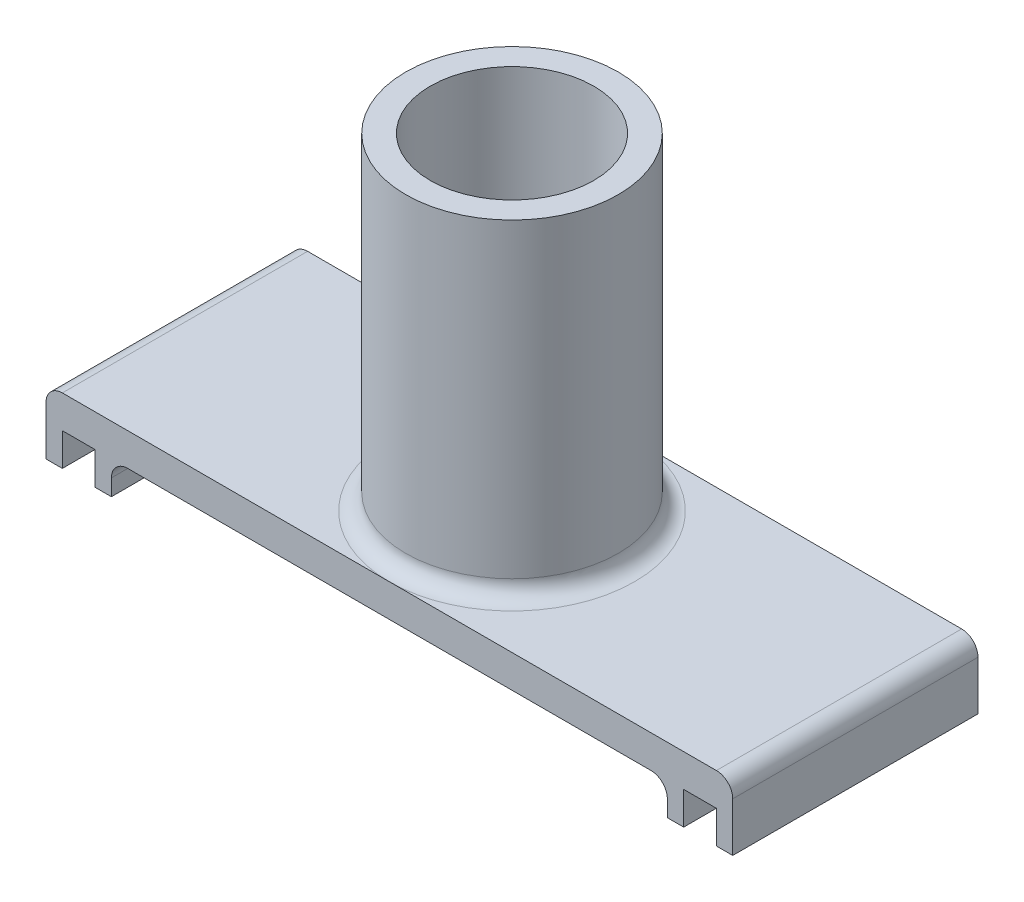
ISO-10303-21;
HEADER;
FILE_DESCRIPTION(('STEP AP214'),'2;1');
FILE_NAME('part.step','',(''),(''),'','','');
FILE_SCHEMA(('AUTOMOTIVE_DESIGN { 1 0 10303 214 1 1 1 1 }'));
ENDSEC;
DATA;
#1=APPLICATION_CONTEXT('core data for automotive mechanical design processes');
#2=APPLICATION_PROTOCOL_DEFINITION('international standard','automotive_design',2000,#1);
#3=PRODUCT_CONTEXT('',#1,'mechanical');
#4=PRODUCT('Part','Part','',(#3));
#5=PRODUCT_RELATED_PRODUCT_CATEGORY('part','',(#4));
#6=PRODUCT_DEFINITION_FORMATION('','',#4);
#7=PRODUCT_DEFINITION_CONTEXT('part definition',#1,'design');
#8=PRODUCT_DEFINITION('design','',#6,#7);
#9=PRODUCT_DEFINITION_SHAPE('','',#8);
#10=(LENGTH_UNIT() NAMED_UNIT(*) SI_UNIT(.MILLI.,.METRE.));
#11=(NAMED_UNIT(*) PLANE_ANGLE_UNIT() SI_UNIT($,.RADIAN.));
#12=(NAMED_UNIT(*) SI_UNIT($,.STERADIAN.) SOLID_ANGLE_UNIT());
#13=UNCERTAINTY_MEASURE_WITH_UNIT(LENGTH_MEASURE(1.E-05),#10,'distance_accuracy_value','');
#14=(GEOMETRIC_REPRESENTATION_CONTEXT(3) GLOBAL_UNCERTAINTY_ASSIGNED_CONTEXT((#13)) GLOBAL_UNIT_ASSIGNED_CONTEXT((#10,
#11,#12)) REPRESENTATION_CONTEXT('',''));
#15=CARTESIAN_POINT('',(0.,0.,0.));
#16=DIRECTION('',(0.,0.,1.));
#17=DIRECTION('',(1.,0.,0.));
#18=AXIS2_PLACEMENT_3D('',#15,#16,#17);
#19=CARTESIAN_POINT('',(0.,20.,0.));
#20=DIRECTION('',(0.,-1.,0.));
#21=DIRECTION('',(0.,0.,-1.));
#22=AXIS2_PLACEMENT_3D('',#19,#20,#21);
#23=PLANE('',#22);
#24=DIRECTION('',(-1.,0.,0.));
#25=VECTOR('',#24,1.);
#26=CARTESIAN_POINT('',(-210.,20.,-75.));
#27=LINE('',#26,#25);
#28=CARTESIAN_POINT('',(200.,20.,-75.));
#29=VERTEX_POINT('',#28);
#30=CARTESIAN_POINT('',(0.,20.,-75.));
#31=VERTEX_POINT('',#30);
#32=EDGE_CURVE('E230',#29,#31,#27,.T.);
#33=ORIENTED_EDGE('',*,*,#32,.T.);
#34=CARTESIAN_POINT('',(0.,20.,0.));
#35=DIRECTION('',(0.,-1.,0.));
#36=DIRECTION('',(0.,0.,-1.));
#37=AXIS2_PLACEMENT_3D('',#34,#35,#36);
#38=CIRCLE('',#37,75.);
#39=CARTESIAN_POINT('',(0.,20.,75.));
#40=VERTEX_POINT('',#39);
#41=EDGE_CURVE('E11',#31,#40,#38,.T.);
#42=ORIENTED_EDGE('',*,*,#41,.T.);
#43=DIRECTION('',(1.,0.,0.));
#44=VECTOR('',#43,1.);
#45=CARTESIAN_POINT('',(-210.,20.,75.));
#46=LINE('',#45,#44);
#47=CARTESIAN_POINT('',(200.,20.,75.));
#48=VERTEX_POINT('',#47);
#49=EDGE_CURVE('E232',#40,#48,#46,.T.);
#50=ORIENTED_EDGE('',*,*,#49,.T.);
#51=DIRECTION('',(0.,0.,-1.));
#52=VECTOR('',#51,1.);
#53=CARTESIAN_POINT('',(200.,20.,0.));
#54=LINE('',#53,#52);
#55=EDGE_CURVE('E245',#48,#29,#54,.T.);
#56=ORIENTED_EDGE('',*,*,#55,.T.);
#57=EDGE_LOOP('',(#33,#42,#50,#56));
#58=FACE_BOUND('',#57,.T.);
#59=ADVANCED_FACE('F41',(#58),#23,.F.);
#60=CARTESIAN_POINT('',(0.,0.,0.));
#61=DIRECTION('',(0.,-1.,0.));
#62=DIRECTION('',(0.,0.,-1.));
#63=AXIS2_PLACEMENT_3D('',#60,#61,#62);
#64=PLANE('',#63);
#65=DIRECTION('',(1.,0.,0.));
#66=VECTOR('',#65,1.);
#67=CARTESIAN_POINT('',(-210.,0.,75.));
#68=LINE('',#67,#66);
#69=CARTESIAN_POINT('',(180.000000000013,0.,75.));
#70=VERTEX_POINT('',#69);
#71=CARTESIAN_POINT('',(200.,0.,75.));
#72=VERTEX_POINT('',#71);
#73=EDGE_CURVE('E200',#70,#72,#68,.T.);
#74=ORIENTED_EDGE('',*,*,#73,.F.);
#75=DIRECTION('',(0.,0.,1.));
#76=VECTOR('',#75,1.);
#77=CARTESIAN_POINT('',(180.,0.,-75.0000000000013));
#78=LINE('',#77,#76);
#79=CARTESIAN_POINT('',(180.,0.,-75.0000000000013));
#80=VERTEX_POINT('',#79);
#81=EDGE_CURVE('E185',#80,#70,#78,.T.);
#82=ORIENTED_EDGE('',*,*,#81,.F.);
#83=DIRECTION('',(-1.,0.,0.));
#84=VECTOR('',#83,1.);
#85=CARTESIAN_POINT('',(-210.,0.,-75.));
#86=LINE('',#85,#84);
#87=CARTESIAN_POINT('',(200.,0.,-75.));
#88=VERTEX_POINT('',#87);
#89=EDGE_CURVE('E199',#88,#80,#86,.T.);
#90=ORIENTED_EDGE('',*,*,#89,.F.);
#91=DIRECTION('',(0.,0.,1.));
#92=VECTOR('',#91,1.);
#93=CARTESIAN_POINT('',(200.,0.,-2.368475785867E-12));
#94=LINE('',#93,#92);
#95=EDGE_CURVE('E698',#88,#72,#94,.T.);
#96=ORIENTED_EDGE('',*,*,#95,.T.);
#97=EDGE_LOOP('',(#74,#82,#90,#96));
#98=FACE_BOUND('',#97,.T.);
#99=ADVANCED_FACE('F197',(#98),#64,.T.);
#100=CARTESIAN_POINT('',(-180.,0.,-75.));
#101=VERTEX_POINT('',#100);
#102=CARTESIAN_POINT('',(-200.,0.,-75.));
#103=VERTEX_POINT('',#102);
#104=EDGE_CURVE('E210',#101,#103,#86,.T.);
#105=ORIENTED_EDGE('',*,*,#104,.F.);
#106=DIRECTION('',(0.,0.,-1.));
#107=VECTOR('',#106,1.);
#108=CARTESIAN_POINT('',(-180.,0.,0.));
#109=LINE('',#108,#107);
#110=CARTESIAN_POINT('',(-180.,0.,75.));
#111=VERTEX_POINT('',#110);
#112=EDGE_CURVE('E407',#111,#101,#109,.T.);
#113=ORIENTED_EDGE('',*,*,#112,.F.);
#114=CARTESIAN_POINT('',(-200.,0.,75.));
#115=VERTEX_POINT('',#114);
#116=EDGE_CURVE('E213',#115,#111,#68,.T.);
#117=ORIENTED_EDGE('',*,*,#116,.F.);
#118=DIRECTION('',(0.,0.,-1.));
#119=VECTOR('',#118,1.);
#120=CARTESIAN_POINT('',(-200.,0.,0.));
#121=LINE('',#120,#119);
#122=EDGE_CURVE('E408',#115,#103,#121,.T.);
#123=ORIENTED_EDGE('',*,*,#122,.T.);
#124=EDGE_LOOP('',(#105,#113,#117,#123));
#125=FACE_BOUND('',#124,.T.);
#126=ADVANCED_FACE('F295',(#125),#64,.T.);
#127=CARTESIAN_POINT('',(0.,0.,0.));
#128=DIRECTION('',(0.,-1.,0.));
#129=DIRECTION('',(0.,0.,-1.));
#130=AXIS2_PLACEMENT_3D('',#127,#128,#129);
#131=CIRCLE('',#130,50.);
#132=CARTESIAN_POINT('',(0.,0.,-50.));
#133=VERTEX_POINT('',#132);
#134=EDGE_CURVE('E677',#133,#133,#131,.T.);
#135=ORIENTED_EDGE('',*,*,#134,.F.);
#136=EDGE_LOOP('',(#135));
#137=FACE_BOUND('',#136,.T.);
#138=CARTESIAN_POINT('',(160.,0.,-75.));
#139=VERTEX_POINT('',#138);
#140=CARTESIAN_POINT('',(-160.,0.,-75.));
#141=VERTEX_POINT('',#140);
#142=EDGE_CURVE('E208',#139,#141,#86,.T.);
#143=ORIENTED_EDGE('',*,*,#142,.F.);
#144=DIRECTION('',(0.,0.,1.));
#145=VECTOR('',#144,1.);
#146=CARTESIAN_POINT('',(160.000000000013,0.,74.9999999999997));
#147=LINE('',#146,#145);
#148=CARTESIAN_POINT('',(160.000000000013,0.,75.));
#149=VERTEX_POINT('',#148);
#150=EDGE_CURVE('E361',#139,#149,#147,.T.);
#151=ORIENTED_EDGE('',*,*,#150,.T.);
#152=CARTESIAN_POINT('',(-160.,0.,75.));
#153=VERTEX_POINT('',#152);
#154=EDGE_CURVE('E211',#153,#149,#68,.T.);
#155=ORIENTED_EDGE('',*,*,#154,.F.);
#156=DIRECTION('',(0.,0.,-1.));
#157=VECTOR('',#156,1.);
#158=CARTESIAN_POINT('',(-160.,0.,-75.));
#159=LINE('',#158,#157);
#160=EDGE_CURVE('E349',#153,#141,#159,.T.);
#161=ORIENTED_EDGE('',*,*,#160,.T.);
#162=EDGE_LOOP('',(#143,#151,#155,#161));
#163=FACE_BOUND('',#162,.T.);
#164=ADVANCED_FACE('F297',(#137,#163),#64,.T.);
#165=CARTESIAN_POINT('',(210.,20.,75.));
#166=DIRECTION('',(-1.,0.,0.));
#167=DIRECTION('',(0.,0.,1.));
#168=AXIS2_PLACEMENT_3D('',#165,#166,#167);
#169=PLANE('',#168);
#170=DIRECTION('',(0.,-1.,0.));
#171=VECTOR('',#170,1.);
#172=CARTESIAN_POINT('',(210.,20.,-75.));
#173=LINE('',#172,#171);
#174=CARTESIAN_POINT('',(210.,10.,-75.));
#175=VERTEX_POINT('',#174);
#176=CARTESIAN_POINT('',(210.,-20.,-75.));
#177=VERTEX_POINT('',#176);
#178=EDGE_CURVE('E347',#175,#177,#173,.T.);
#179=ORIENTED_EDGE('',*,*,#178,.F.);
#180=DIRECTION('',(0.,0.,-1.));
#181=VECTOR('',#180,1.);
#182=CARTESIAN_POINT('',(210.,10.,75.));
#183=LINE('',#182,#181);
#184=CARTESIAN_POINT('',(210.,10.,75.));
#185=VERTEX_POINT('',#184);
#186=EDGE_CURVE('E255',#175,#185,#183,.F.);
#187=ORIENTED_EDGE('',*,*,#186,.T.);
#188=DIRECTION('',(0.,-1.,0.));
#189=VECTOR('',#188,1.);
#190=CARTESIAN_POINT('',(210.,20.,75.));
#191=LINE('',#190,#189);
#192=CARTESIAN_POINT('',(210.,-20.,75.));
#193=VERTEX_POINT('',#192);
#194=EDGE_CURVE('E235',#185,#193,#191,.T.);
#195=ORIENTED_EDGE('',*,*,#194,.T.);
#196=DIRECTION('',(0.,0.,1.));
#197=VECTOR('',#196,1.);
#198=CARTESIAN_POINT('',(210.,-20.,0.));
#199=LINE('',#198,#197);
#200=EDGE_CURVE('E702',#177,#193,#199,.T.);
#201=ORIENTED_EDGE('',*,*,#200,.F.);
#202=EDGE_LOOP('',(#179,#187,#195,#201));
#203=FACE_BOUND('',#202,.T.);
#204=ADVANCED_FACE('F317',(#203),#169,.F.);
#205=CARTESIAN_POINT('',(-210.,20.,-75.));
#206=DIRECTION('',(0.,0.,1.));
#207=DIRECTION('',(1.,0.,0.));
#208=AXIS2_PLACEMENT_3D('',#205,#206,#207);
#209=PLANE('',#208);
#210=DIRECTION('',(0.,-1.,0.));
#211=VECTOR('',#210,1.);
#212=CARTESIAN_POINT('',(-210.,20.,-75.));
#213=LINE('',#212,#211);
#214=CARTESIAN_POINT('',(-210.,10.,-75.));
#215=VERTEX_POINT('',#214);
#216=CARTESIAN_POINT('',(-210.,-20.,-75.));
#217=VERTEX_POINT('',#216);
#218=EDGE_CURVE('E344',#215,#217,#213,.T.);
#219=ORIENTED_EDGE('',*,*,#218,.F.);
#220=CARTESIAN_POINT('',(-200.,10.,-75.));
#221=DIRECTION('',(0.,0.,1.));
#222=DIRECTION('',(1.,0.,0.));
#223=AXIS2_PLACEMENT_3D('',#220,#221,#222);
#224=CIRCLE('',#223,10.);
#225=CARTESIAN_POINT('',(-200.,20.,-75.));
#226=VERTEX_POINT('',#225);
#227=EDGE_CURVE('E272',#215,#226,#224,.F.);
#228=ORIENTED_EDGE('',*,*,#227,.T.);
#229=EDGE_CURVE('E233',#31,#226,#27,.T.);
#230=ORIENTED_EDGE('',*,*,#229,.F.);
#231=ORIENTED_EDGE('',*,*,#32,.F.);
#232=CARTESIAN_POINT('',(200.,10.,-75.));
#233=DIRECTION('',(0.,0.,1.));
#234=DIRECTION('',(1.,0.,0.));
#235=AXIS2_PLACEMENT_3D('',#232,#233,#234);
#236=CIRCLE('',#235,10.);
#237=EDGE_CURVE('E258',#29,#175,#236,.F.);
#238=ORIENTED_EDGE('',*,*,#237,.T.);
#239=ORIENTED_EDGE('',*,*,#178,.T.);
#240=DIRECTION('',(1.,0.,0.));
#241=VECTOR('',#240,1.);
#242=CARTESIAN_POINT('',(0.,-20.,-75.));
#243=LINE('',#242,#241);
#244=CARTESIAN_POINT('',(200.,-20.,-75.));
#245=VERTEX_POINT('',#244);
#246=EDGE_CURVE('E705',#245,#177,#243,.T.);
#247=ORIENTED_EDGE('',*,*,#246,.F.);
#248=DIRECTION('',(0.,1.,0.));
#249=VECTOR('',#248,1.);
#250=CARTESIAN_POINT('',(200.,-20.,-75.));
#251=LINE('',#250,#249);
#252=EDGE_CURVE('E201',#245,#88,#251,.T.);
#253=ORIENTED_EDGE('',*,*,#252,.T.);
#254=ORIENTED_EDGE('',*,*,#89,.T.);
#255=DIRECTION('',(0.,1.,0.));
#256=VECTOR('',#255,1.);
#257=CARTESIAN_POINT('',(180.,-20.,-75.0000000000013));
#258=LINE('',#257,#256);
#259=CARTESIAN_POINT('',(180.,-20.,-75.0000000000013));
#260=VERTEX_POINT('',#259);
#261=EDGE_CURVE('E181',#260,#80,#258,.T.);
#262=ORIENTED_EDGE('',*,*,#261,.F.);
#263=DIRECTION('',(-1.,0.,0.));
#264=VECTOR('',#263,1.);
#265=CARTESIAN_POINT('',(180.,-20.,-75.0000000000013));
#266=LINE('',#265,#264);
#267=CARTESIAN_POINT('',(170.,-20.,-75.0000000000012));
#268=VERTEX_POINT('',#267);
#269=EDGE_CURVE('E202',#260,#268,#266,.T.);
#270=ORIENTED_EDGE('',*,*,#269,.T.);
#271=DIRECTION('',(0.,1.,0.));
#272=VECTOR('',#271,1.);
#273=CARTESIAN_POINT('',(170.,-20.,-75.0000000000012));
#274=LINE('',#273,#272);
#275=CARTESIAN_POINT('',(170.,-10.,-75.0000000000012));
#276=VERTEX_POINT('',#275);
#277=EDGE_CURVE('E379',#268,#276,#274,.T.);
#278=ORIENTED_EDGE('',*,*,#277,.T.);
#279=CARTESIAN_POINT('',(160.,-10.,-75.));
#280=DIRECTION('',(0.,0.,1.));
#281=DIRECTION('',(1.,0.,0.));
#282=AXIS2_PLACEMENT_3D('',#279,#280,#281);
#283=CIRCLE('',#282,10.);
#284=EDGE_CURVE('E259',#276,#139,#283,.T.);
#285=ORIENTED_EDGE('',*,*,#284,.T.);
#286=ORIENTED_EDGE('',*,*,#142,.T.);
#287=CARTESIAN_POINT('',(-160.,-10.,-75.));
#288=DIRECTION('',(0.,0.,1.));
#289=DIRECTION('',(1.,0.,0.));
#290=AXIS2_PLACEMENT_3D('',#287,#288,#289);
#291=CIRCLE('',#290,10.);
#292=CARTESIAN_POINT('',(-170.,-10.,-75.));
#293=VERTEX_POINT('',#292);
#294=EDGE_CURVE('E357',#141,#293,#291,.T.);
#295=ORIENTED_EDGE('',*,*,#294,.T.);
#296=DIRECTION('',(0.,1.,0.));
#297=VECTOR('',#296,1.);
#298=CARTESIAN_POINT('',(-170.,-20.,-75.));
#299=LINE('',#298,#297);
#300=CARTESIAN_POINT('',(-170.,-20.,-75.));
#301=VERTEX_POINT('',#300);
#302=EDGE_CURVE('E391',#301,#293,#299,.T.);
#303=ORIENTED_EDGE('',*,*,#302,.F.);
#304=DIRECTION('',(1.,0.,0.));
#305=VECTOR('',#304,1.);
#306=CARTESIAN_POINT('',(0.,-20.,-75.));
#307=LINE('',#306,#305);
#308=CARTESIAN_POINT('',(-180.,-20.,-75.));
#309=VERTEX_POINT('',#308);
#310=EDGE_CURVE('E398',#309,#301,#307,.T.);
#311=ORIENTED_EDGE('',*,*,#310,.F.);
#312=DIRECTION('',(0.,1.,0.));
#313=VECTOR('',#312,1.);
#314=CARTESIAN_POINT('',(-180.,-20.,-75.));
#315=LINE('',#314,#313);
#316=EDGE_CURVE('E399',#309,#101,#315,.T.);
#317=ORIENTED_EDGE('',*,*,#316,.T.);
#318=ORIENTED_EDGE('',*,*,#104,.T.);
#319=DIRECTION('',(0.,1.,0.));
#320=VECTOR('',#319,1.);
#321=CARTESIAN_POINT('',(-200.,-20.,-75.));
#322=LINE('',#321,#320);
#323=CARTESIAN_POINT('',(-200.,-20.,-75.));
#324=VERTEX_POINT('',#323);
#325=EDGE_CURVE('E220',#324,#103,#322,.T.);
#326=ORIENTED_EDGE('',*,*,#325,.F.);
#327=DIRECTION('',(1.,0.,0.));
#328=VECTOR('',#327,1.);
#329=CARTESIAN_POINT('',(0.,-20.,-75.));
#330=LINE('',#329,#328);
#331=EDGE_CURVE('E226',#217,#324,#330,.T.);
#332=ORIENTED_EDGE('',*,*,#331,.F.);
#333=EDGE_LOOP('',(#219,#228,#230,#231,#238,#239,#247,#253,#254,#262,#270,#278,#285,#286,#295,
#303,#311,#317,#318,#326,#332));
#334=FACE_BOUND('',#333,.T.);
#335=ADVANCED_FACE('F205',(#334),#209,.F.);
#336=CARTESIAN_POINT('',(-210.,20.,75.));
#337=DIRECTION('',(1.,0.,0.));
#338=DIRECTION('',(0.,0.,-1.));
#339=AXIS2_PLACEMENT_3D('',#336,#337,#338);
#340=PLANE('',#339);
#341=DIRECTION('',(0.,-1.,0.));
#342=VECTOR('',#341,1.);
#343=CARTESIAN_POINT('',(-210.,20.,75.));
#344=LINE('',#343,#342);
#345=CARTESIAN_POINT('',(-210.,10.,75.));
#346=VERTEX_POINT('',#345);
#347=CARTESIAN_POINT('',(-210.,-20.,75.));
#348=VERTEX_POINT('',#347);
#349=EDGE_CURVE('E238',#346,#348,#344,.T.);
#350=ORIENTED_EDGE('',*,*,#349,.F.);
#351=DIRECTION('',(0.,0.,1.));
#352=VECTOR('',#351,1.);
#353=CARTESIAN_POINT('',(-210.,10.,75.));
#354=LINE('',#353,#352);
#355=EDGE_CURVE('E270',#346,#215,#354,.F.);
#356=ORIENTED_EDGE('',*,*,#355,.T.);
#357=ORIENTED_EDGE('',*,*,#218,.T.);
#358=DIRECTION('',(0.,0.,-1.));
#359=VECTOR('',#358,1.);
#360=CARTESIAN_POINT('',(-210.,-20.,0.));
#361=LINE('',#360,#359);
#362=EDGE_CURVE('E420',#348,#217,#361,.T.);
#363=ORIENTED_EDGE('',*,*,#362,.F.);
#364=EDGE_LOOP('',(#350,#356,#357,#363));
#365=FACE_BOUND('',#364,.T.);
#366=ADVANCED_FACE('F307',(#365),#340,.F.);
#367=CARTESIAN_POINT('',(-210.,20.,75.));
#368=DIRECTION('',(0.,0.,-1.));
#369=DIRECTION('',(-1.,0.,0.));
#370=AXIS2_PLACEMENT_3D('',#367,#368,#369);
#371=PLANE('',#370);
#372=CARTESIAN_POINT('',(-200.,20.,75.));
#373=VERTEX_POINT('',#372);
#374=EDGE_CURVE('E234',#373,#40,#46,.T.);
#375=ORIENTED_EDGE('',*,*,#374,.F.);
#376=CARTESIAN_POINT('',(-200.,10.,75.));
#377=DIRECTION('',(0.,0.,-1.));
#378=DIRECTION('',(-1.,0.,0.));
#379=AXIS2_PLACEMENT_3D('',#376,#377,#378);
#380=CIRCLE('',#379,10.);
#381=EDGE_CURVE('E268',#373,#346,#380,.F.);
#382=ORIENTED_EDGE('',*,*,#381,.T.);
#383=ORIENTED_EDGE('',*,*,#349,.T.);
#384=DIRECTION('',(-1.,0.,0.));
#385=VECTOR('',#384,1.);
#386=CARTESIAN_POINT('',(0.,-20.,75.));
#387=LINE('',#386,#385);
#388=CARTESIAN_POINT('',(-200.,-20.,75.));
#389=VERTEX_POINT('',#388);
#390=EDGE_CURVE('E417',#389,#348,#387,.T.);
#391=ORIENTED_EDGE('',*,*,#390,.F.);
#392=DIRECTION('',(0.,1.,0.));
#393=VECTOR('',#392,1.);
#394=CARTESIAN_POINT('',(-200.,-20.,75.));
#395=LINE('',#394,#393);
#396=EDGE_CURVE('E215',#389,#115,#395,.T.);
#397=ORIENTED_EDGE('',*,*,#396,.T.);
#398=ORIENTED_EDGE('',*,*,#116,.T.);
#399=DIRECTION('',(0.,1.,0.));
#400=VECTOR('',#399,1.);
#401=CARTESIAN_POINT('',(-180.,-20.,75.));
#402=LINE('',#401,#400);
#403=CARTESIAN_POINT('',(-180.,-20.,75.));
#404=VERTEX_POINT('',#403);
#405=EDGE_CURVE('E403',#404,#111,#402,.T.);
#406=ORIENTED_EDGE('',*,*,#405,.F.);
#407=DIRECTION('',(-1.,0.,0.));
#408=VECTOR('',#407,1.);
#409=CARTESIAN_POINT('',(0.,-20.,75.));
#410=LINE('',#409,#408);
#411=CARTESIAN_POINT('',(-170.,-20.,75.));
#412=VERTEX_POINT('',#411);
#413=EDGE_CURVE('E411',#412,#404,#410,.T.);
#414=ORIENTED_EDGE('',*,*,#413,.F.);
#415=DIRECTION('',(0.,1.,0.));
#416=VECTOR('',#415,1.);
#417=CARTESIAN_POINT('',(-170.,-20.,75.));
#418=LINE('',#417,#416);
#419=CARTESIAN_POINT('',(-170.,-10.,75.));
#420=VERTEX_POINT('',#419);
#421=EDGE_CURVE('E433',#412,#420,#418,.T.);
#422=ORIENTED_EDGE('',*,*,#421,.T.);
#423=CARTESIAN_POINT('',(-160.,-10.,75.));
#424=DIRECTION('',(0.,0.,-1.));
#425=DIRECTION('',(-1.,0.,0.));
#426=AXIS2_PLACEMENT_3D('',#423,#424,#425);
#427=CIRCLE('',#426,10.);
#428=EDGE_CURVE('E359',#420,#153,#427,.T.);
#429=ORIENTED_EDGE('',*,*,#428,.T.);
#430=ORIENTED_EDGE('',*,*,#154,.T.);
#431=CARTESIAN_POINT('',(160.000000000013,-10.,75.));
#432=DIRECTION('',(0.,0.,-1.));
#433=DIRECTION('',(-1.,0.,0.));
#434=AXIS2_PLACEMENT_3D('',#431,#432,#433);
#435=CIRCLE('',#434,10.);
#436=CARTESIAN_POINT('',(170.000000000013,-10.,74.9999999999988));
#437=VERTEX_POINT('',#436);
#438=EDGE_CURVE('E262',#149,#437,#435,.T.);
#439=ORIENTED_EDGE('',*,*,#438,.T.);
#440=DIRECTION('',(0.,1.,0.));
#441=VECTOR('',#440,1.);
#442=CARTESIAN_POINT('',(170.000000000013,-20.,74.9999999999988));
#443=LINE('',#442,#441);
#444=CARTESIAN_POINT('',(170.000000000013,-20.,74.9999999999988));
#445=VERTEX_POINT('',#444);
#446=EDGE_CURVE('E369',#445,#437,#443,.T.);
#447=ORIENTED_EDGE('',*,*,#446,.F.);
#448=DIRECTION('',(-1.,0.,0.));
#449=VECTOR('',#448,1.);
#450=CARTESIAN_POINT('',(180.000000000013,-20.,74.9999999999979));
#451=LINE('',#450,#449);
#452=CARTESIAN_POINT('',(180.000000000013,-20.,74.9999999999979));
#453=VERTEX_POINT('',#452);
#454=EDGE_CURVE('E689',#453,#445,#451,.T.);
#455=ORIENTED_EDGE('',*,*,#454,.F.);
#456=DIRECTION('',(0.,1.,0.));
#457=VECTOR('',#456,1.);
#458=CARTESIAN_POINT('',(180.000000000013,-20.,74.9999999999979));
#459=LINE('',#458,#457);
#460=EDGE_CURVE('E192',#453,#70,#459,.T.);
#461=ORIENTED_EDGE('',*,*,#460,.T.);
#462=ORIENTED_EDGE('',*,*,#73,.T.);
#463=DIRECTION('',(0.,1.,0.));
#464=VECTOR('',#463,1.);
#465=CARTESIAN_POINT('',(200.,-20.,75.));
#466=LINE('',#465,#464);
#467=CARTESIAN_POINT('',(200.,-20.,75.));
#468=VERTEX_POINT('',#467);
#469=EDGE_CURVE('E694',#468,#72,#466,.T.);
#470=ORIENTED_EDGE('',*,*,#469,.F.);
#471=DIRECTION('',(-1.,0.,0.));
#472=VECTOR('',#471,1.);
#473=CARTESIAN_POINT('',(0.,-20.,75.));
#474=LINE('',#473,#472);
#475=EDGE_CURVE('E697',#193,#468,#474,.T.);
#476=ORIENTED_EDGE('',*,*,#475,.F.);
#477=ORIENTED_EDGE('',*,*,#194,.F.);
#478=CARTESIAN_POINT('',(200.,10.,75.));
#479=DIRECTION('',(0.,0.,-1.));
#480=DIRECTION('',(-1.,0.,0.));
#481=AXIS2_PLACEMENT_3D('',#478,#479,#480);
#482=CIRCLE('',#481,10.);
#483=EDGE_CURVE('E249',#185,#48,#482,.F.);
#484=ORIENTED_EDGE('',*,*,#483,.T.);
#485=ORIENTED_EDGE('',*,*,#49,.F.);
#486=EDGE_LOOP('',(#375,#382,#383,#391,#397,#398,#406,#414,#422,#429,#430,#439,#447,#455,#461,
#462,#470,#476,#477,#484,#485));
#487=FACE_BOUND('',#486,.T.);
#488=ADVANCED_FACE('F250',(#487),#371,.F.);
#489=ORIENTED_EDGE('',*,*,#374,.T.);
#490=CARTESIAN_POINT('',(0.,20.,0.));
#491=DIRECTION('',(0.,-1.,0.));
#492=DIRECTION('',(0.,0.,-1.));
#493=AXIS2_PLACEMENT_3D('',#490,#491,#492);
#494=CIRCLE('',#493,75.);
#495=EDGE_CURVE('E49',#40,#31,#494,.T.);
#496=ORIENTED_EDGE('',*,*,#495,.T.);
#497=ORIENTED_EDGE('',*,*,#229,.T.);
#498=DIRECTION('',(0.,0.,1.));
#499=VECTOR('',#498,1.);
#500=CARTESIAN_POINT('',(-200.,20.,0.));
#501=LINE('',#500,#499);
#502=EDGE_CURVE('E254',#226,#373,#501,.T.);
#503=ORIENTED_EDGE('',*,*,#502,.T.);
#504=EDGE_LOOP('',(#489,#496,#497,#503));
#505=FACE_BOUND('',#504,.T.);
#506=ADVANCED_FACE('F291',(#505),#23,.F.);
#507=CARTESIAN_POINT('',(-200.,-20.,0.));
#508=DIRECTION('',(1.,0.,0.));
#509=DIRECTION('',(0.,0.,-1.));
#510=AXIS2_PLACEMENT_3D('',#507,#508,#509);
#511=PLANE('',#510);
#512=ORIENTED_EDGE('',*,*,#122,.F.);
#513=ORIENTED_EDGE('',*,*,#396,.F.);
#514=DIRECTION('',(0.,0.,-1.));
#515=VECTOR('',#514,1.);
#516=CARTESIAN_POINT('',(-200.,-20.,0.));
#517=LINE('',#516,#515);
#518=EDGE_CURVE('E414',#389,#324,#517,.T.);
#519=ORIENTED_EDGE('',*,*,#518,.T.);
#520=ORIENTED_EDGE('',*,*,#325,.T.);
#521=EDGE_LOOP('',(#512,#513,#519,#520));
#522=FACE_BOUND('',#521,.T.);
#523=ADVANCED_FACE('F300',(#522),#511,.T.);
#524=CARTESIAN_POINT('',(0.,-20.,0.));
#525=DIRECTION('',(0.,-1.,0.));
#526=DIRECTION('',(0.,0.,-1.));
#527=AXIS2_PLACEMENT_3D('',#524,#525,#526);
#528=PLANE('',#527);
#529=ORIENTED_EDGE('',*,*,#518,.F.);
#530=ORIENTED_EDGE('',*,*,#390,.T.);
#531=ORIENTED_EDGE('',*,*,#362,.T.);
#532=ORIENTED_EDGE('',*,*,#331,.T.);
#533=EDGE_LOOP('',(#529,#530,#531,#532));
#534=FACE_BOUND('',#533,.T.);
#535=ADVANCED_FACE('F305',(#534),#528,.T.);
#536=CARTESIAN_POINT('',(-170.,-20.,0.));
#537=DIRECTION('',(1.,0.,0.));
#538=DIRECTION('',(0.,0.,-1.));
#539=AXIS2_PLACEMENT_3D('',#536,#537,#538);
#540=PLANE('',#539);
#541=ORIENTED_EDGE('',*,*,#302,.T.);
#542=DIRECTION('',(0.,0.,-1.));
#543=VECTOR('',#542,1.);
#544=CARTESIAN_POINT('',(-170.,-10.,75.));
#545=LINE('',#544,#543);
#546=EDGE_CURVE('E355',#293,#420,#545,.F.);
#547=ORIENTED_EDGE('',*,*,#546,.T.);
#548=ORIENTED_EDGE('',*,*,#421,.F.);
#549=DIRECTION('',(0.,0.,-1.));
#550=VECTOR('',#549,1.);
#551=CARTESIAN_POINT('',(-170.,-20.,0.));
#552=LINE('',#551,#550);
#553=EDGE_CURVE('E397',#412,#301,#552,.T.);
#554=ORIENTED_EDGE('',*,*,#553,.T.);
#555=EDGE_LOOP('',(#541,#547,#548,#554));
#556=FACE_BOUND('',#555,.T.);
#557=ADVANCED_FACE('F394',(#556),#540,.T.);
#558=CARTESIAN_POINT('',(-180.,-20.,0.));
#559=DIRECTION('',(1.,0.,0.));
#560=DIRECTION('',(0.,0.,-1.));
#561=AXIS2_PLACEMENT_3D('',#558,#559,#560);
#562=PLANE('',#561);
#563=ORIENTED_EDGE('',*,*,#112,.T.);
#564=ORIENTED_EDGE('',*,*,#316,.F.);
#565=DIRECTION('',(0.,0.,-1.));
#566=VECTOR('',#565,1.);
#567=CARTESIAN_POINT('',(-180.,-20.,0.));
#568=LINE('',#567,#566);
#569=EDGE_CURVE('E401',#404,#309,#568,.T.);
#570=ORIENTED_EDGE('',*,*,#569,.F.);
#571=ORIENTED_EDGE('',*,*,#405,.T.);
#572=EDGE_LOOP('',(#563,#564,#570,#571));
#573=FACE_BOUND('',#572,.T.);
#574=ADVANCED_FACE('F435',(#573),#562,.F.);
#575=CARTESIAN_POINT('',(0.,-20.,0.));
#576=DIRECTION('',(0.,-1.,0.));
#577=DIRECTION('',(0.,0.,-1.));
#578=AXIS2_PLACEMENT_3D('',#575,#576,#577);
#579=PLANE('',#578);
#580=ORIENTED_EDGE('',*,*,#553,.F.);
#581=ORIENTED_EDGE('',*,*,#413,.T.);
#582=ORIENTED_EDGE('',*,*,#569,.T.);
#583=ORIENTED_EDGE('',*,*,#310,.T.);
#584=EDGE_LOOP('',(#580,#581,#582,#583));
#585=FACE_BOUND('',#584,.T.);
#586=ADVANCED_FACE('F437',(#585),#579,.T.);
#587=CARTESIAN_POINT('',(200.,-20.,-2.368475785867E-12));
#588=DIRECTION('',(-1.,0.,0.));
#589=DIRECTION('',(0.,0.,1.));
#590=AXIS2_PLACEMENT_3D('',#587,#588,#589);
#591=PLANE('',#590);
#592=ORIENTED_EDGE('',*,*,#95,.F.);
#593=ORIENTED_EDGE('',*,*,#252,.F.);
#594=DIRECTION('',(0.,0.,1.));
#595=VECTOR('',#594,1.);
#596=CARTESIAN_POINT('',(200.,-20.,-2.368475785867E-12));
#597=LINE('',#596,#595);
#598=EDGE_CURVE('E700',#245,#468,#597,.T.);
#599=ORIENTED_EDGE('',*,*,#598,.T.);
#600=ORIENTED_EDGE('',*,*,#469,.T.);
#601=EDGE_LOOP('',(#592,#593,#599,#600));
#602=FACE_BOUND('',#601,.T.);
#603=ADVANCED_FACE('F439',(#602),#591,.T.);
#604=CARTESIAN_POINT('',(0.,-20.,0.));
#605=DIRECTION('',(0.,-1.,0.));
#606=DIRECTION('',(0.,0.,-1.));
#607=AXIS2_PLACEMENT_3D('',#604,#605,#606);
#608=PLANE('',#607);
#609=ORIENTED_EDGE('',*,*,#598,.F.);
#610=ORIENTED_EDGE('',*,*,#246,.T.);
#611=ORIENTED_EDGE('',*,*,#200,.T.);
#612=ORIENTED_EDGE('',*,*,#475,.T.);
#613=EDGE_LOOP('',(#609,#610,#611,#612));
#614=FACE_BOUND('',#613,.T.);
#615=ADVANCED_FACE('F445',(#614),#608,.T.);
#616=CARTESIAN_POINT('',(180.,-20.,-75.0000000000013));
#617=DIRECTION('',(-1.,0.,0.));
#618=DIRECTION('',(0.,0.,1.));
#619=AXIS2_PLACEMENT_3D('',#616,#617,#618);
#620=PLANE('',#619);
#621=ORIENTED_EDGE('',*,*,#81,.T.);
#622=ORIENTED_EDGE('',*,*,#460,.F.);
#623=DIRECTION('',(0.,0.,1.));
#624=VECTOR('',#623,1.);
#625=CARTESIAN_POINT('',(180.,-20.,-75.0000000000013));
#626=LINE('',#625,#624);
#627=EDGE_CURVE('E187',#260,#453,#626,.T.);
#628=ORIENTED_EDGE('',*,*,#627,.F.);
#629=ORIENTED_EDGE('',*,*,#261,.T.);
#630=EDGE_LOOP('',(#621,#622,#628,#629));
#631=FACE_BOUND('',#630,.T.);
#632=ADVANCED_FACE('F183',(#631),#620,.F.);
#633=CARTESIAN_POINT('',(170.,-20.,-75.0000000000012));
#634=DIRECTION('',(-1.,0.,0.));
#635=DIRECTION('',(0.,0.,1.));
#636=AXIS2_PLACEMENT_3D('',#633,#634,#635);
#637=PLANE('',#636);
#638=ORIENTED_EDGE('',*,*,#446,.T.);
#639=DIRECTION('',(0.,0.,1.));
#640=VECTOR('',#639,1.);
#641=CARTESIAN_POINT('',(170.,-10.,-75.0000000000012));
#642=LINE('',#641,#640);
#643=EDGE_CURVE('E364',#437,#276,#642,.F.);
#644=ORIENTED_EDGE('',*,*,#643,.T.);
#645=ORIENTED_EDGE('',*,*,#277,.F.);
#646=DIRECTION('',(0.,0.,1.));
#647=VECTOR('',#646,1.);
#648=CARTESIAN_POINT('',(170.,-20.,-75.0000000000012));
#649=LINE('',#648,#647);
#650=EDGE_CURVE('E378',#268,#445,#649,.T.);
#651=ORIENTED_EDGE('',*,*,#650,.T.);
#652=EDGE_LOOP('',(#638,#644,#645,#651));
#653=FACE_BOUND('',#652,.T.);
#654=ADVANCED_FACE('F375',(#653),#637,.T.);
#655=CARTESIAN_POINT('',(0.,-20.,0.));
#656=DIRECTION('',(0.,1.,0.));
#657=DIRECTION('',(0.,0.,1.));
#658=AXIS2_PLACEMENT_3D('',#655,#656,#657);
#659=PLANE('',#658);
#660=ORIENTED_EDGE('',*,*,#269,.F.);
#661=ORIENTED_EDGE('',*,*,#627,.T.);
#662=ORIENTED_EDGE('',*,*,#454,.T.);
#663=ORIENTED_EDGE('',*,*,#650,.F.);
#664=EDGE_LOOP('',(#660,#661,#662,#663));
#665=FACE_BOUND('',#664,.T.);
#666=ADVANCED_FACE('F325',(#665),#659,.F.);
#667=CARTESIAN_POINT('',(-160.,-10.,0.));
#668=DIRECTION('',(0.,0.,1.));
#669=DIRECTION('',(1.,0.,0.));
#670=AXIS2_PLACEMENT_3D('',#667,#668,#669);
#671=CYLINDRICAL_SURFACE('',#670,10.);
#672=ORIENTED_EDGE('',*,*,#428,.F.);
#673=ORIENTED_EDGE('',*,*,#546,.F.);
#674=ORIENTED_EDGE('',*,*,#294,.F.);
#675=ORIENTED_EDGE('',*,*,#160,.F.);
#676=EDGE_LOOP('',(#672,#673,#674,#675));
#677=FACE_BOUND('',#676,.T.);
#678=ADVANCED_FACE('F321',(#677),#671,.F.);
#679=CARTESIAN_POINT('',(160.000000000006,-10.,-1.4684549872376E-11));
#680=DIRECTION('',(0.,0.,-1.));
#681=DIRECTION('',(-1.,0.,0.));
#682=AXIS2_PLACEMENT_3D('',#679,#680,#681);
#683=CYLINDRICAL_SURFACE('',#682,10.);
#684=ORIENTED_EDGE('',*,*,#284,.F.);
#685=ORIENTED_EDGE('',*,*,#643,.F.);
#686=ORIENTED_EDGE('',*,*,#438,.F.);
#687=ORIENTED_EDGE('',*,*,#150,.F.);
#688=EDGE_LOOP('',(#684,#685,#686,#687));
#689=FACE_BOUND('',#688,.T.);
#690=ADVANCED_FACE('F324',(#689),#683,.F.);
#691=CARTESIAN_POINT('',(200.,10.,0.));
#692=DIRECTION('',(0.,0.,-1.));
#693=DIRECTION('',(-1.,0.,0.));
#694=AXIS2_PLACEMENT_3D('',#691,#692,#693);
#695=CYLINDRICAL_SURFACE('',#694,10.);
#696=ORIENTED_EDGE('',*,*,#483,.F.);
#697=ORIENTED_EDGE('',*,*,#186,.F.);
#698=ORIENTED_EDGE('',*,*,#237,.F.);
#699=ORIENTED_EDGE('',*,*,#55,.F.);
#700=EDGE_LOOP('',(#696,#697,#698,#699));
#701=FACE_BOUND('',#700,.T.);
#702=ADVANCED_FACE('F257',(#701),#695,.T.);
#703=CARTESIAN_POINT('',(-200.,10.,0.));
#704=DIRECTION('',(0.,0.,1.));
#705=DIRECTION('',(1.,0.,0.));
#706=AXIS2_PLACEMENT_3D('',#703,#704,#705);
#707=CYLINDRICAL_SURFACE('',#706,10.);
#708=ORIENTED_EDGE('',*,*,#227,.F.);
#709=ORIENTED_EDGE('',*,*,#355,.F.);
#710=ORIENTED_EDGE('',*,*,#381,.F.);
#711=ORIENTED_EDGE('',*,*,#502,.F.);
#712=EDGE_LOOP('',(#708,#709,#710,#711));
#713=FACE_BOUND('',#712,.T.);
#714=ADVANCED_FACE('F331',(#713),#707,.T.);
#715=CARTESIAN_POINT('',(0.,220.,0.));
#716=DIRECTION('',(0.,1.,0.));
#717=DIRECTION('',(0.,0.,1.));
#718=AXIS2_PLACEMENT_3D('',#715,#716,#717);
#719=PLANE('',#718);
#720=CARTESIAN_POINT('',(0.,220.,0.));
#721=DIRECTION('',(0.,1.,0.));
#722=DIRECTION('',(0.,0.,1.));
#723=AXIS2_PLACEMENT_3D('',#720,#721,#722);
#724=CIRCLE('',#723,65.);
#725=CARTESIAN_POINT('',(0.,220.,65.));
#726=VERTEX_POINT('',#725);
#727=EDGE_CURVE('E193',#726,#726,#724,.T.);
#728=ORIENTED_EDGE('',*,*,#727,.T.);
#729=EDGE_LOOP('',(#728));
#730=FACE_BOUND('',#729,.T.);
#731=CARTESIAN_POINT('',(0.,220.,0.));
#732=DIRECTION('',(0.,1.,0.));
#733=DIRECTION('',(0.,0.,1.));
#734=AXIS2_PLACEMENT_3D('',#731,#732,#733);
#735=CIRCLE('',#734,50.);
#736=CARTESIAN_POINT('',(0.,220.,50.));
#737=VERTEX_POINT('',#736);
#738=EDGE_CURVE('E679',#737,#737,#735,.T.);
#739=ORIENTED_EDGE('',*,*,#738,.F.);
#740=EDGE_LOOP('',(#739));
#741=FACE_BOUND('',#740,.T.);
#742=ADVANCED_FACE('F333',(#730,#741),#719,.T.);
#743=CARTESIAN_POINT('',(0.,220.,0.));
#744=DIRECTION('',(0.,-1.,0.));
#745=DIRECTION('',(0.,0.,-1.));
#746=AXIS2_PLACEMENT_3D('',#743,#744,#745);
#747=CYLINDRICAL_SURFACE('',#746,65.);
#748=CARTESIAN_POINT('',(0.,30.,0.));
#749=DIRECTION('',(0.,-1.,0.));
#750=DIRECTION('',(0.,0.,-1.));
#751=AXIS2_PLACEMENT_3D('',#748,#749,#750);
#752=CIRCLE('',#751,65.);
#753=CARTESIAN_POINT('',(0.,30.,-65.));
#754=VERTEX_POINT('',#753);
#755=EDGE_CURVE('E275',#754,#754,#752,.F.);
#756=ORIENTED_EDGE('',*,*,#755,.T.);
#757=EDGE_LOOP('',(#756));
#758=FACE_BOUND('',#757,.T.);
#759=ORIENTED_EDGE('',*,*,#727,.F.);
#760=EDGE_LOOP('',(#759));
#761=FACE_BOUND('',#760,.T.);
#762=ADVANCED_FACE('F279',(#758,#761),#747,.T.);
#763=CARTESIAN_POINT('',(0.,220.,0.));
#764=DIRECTION('',(0.,-1.,0.));
#765=DIRECTION('',(0.,0.,-1.));
#766=AXIS2_PLACEMENT_3D('',#763,#764,#765);
#767=CYLINDRICAL_SURFACE('',#766,50.);
#768=ORIENTED_EDGE('',*,*,#738,.T.);
#769=EDGE_LOOP('',(#768));
#770=FACE_BOUND('',#769,.T.);
#771=ORIENTED_EDGE('',*,*,#134,.T.);
#772=EDGE_LOOP('',(#771));
#773=FACE_BOUND('',#772,.T.);
#774=ADVANCED_FACE('F283',(#770,#773),#767,.F.);
#775=CARTESIAN_POINT('',(0.,30.,0.));
#776=DIRECTION('',(0.,-1.,0.));
#777=DIRECTION('',(0.,0.,-1.));
#778=AXIS2_PLACEMENT_3D('',#775,#776,#777);
#779=TOROIDAL_SURFACE('',#778,75.,10.);
#780=ORIENTED_EDGE('',*,*,#495,.F.);
#781=ORIENTED_EDGE('',*,*,#41,.F.);
#782=EDGE_LOOP('',(#780,#781));
#783=FACE_BOUND('',#782,.T.);
#784=ORIENTED_EDGE('',*,*,#755,.F.);
#785=EDGE_LOOP('',(#784));
#786=FACE_BOUND('',#785,.T.);
#787=ADVANCED_FACE('F43',(#783,#786),#779,.F.);
#788=CLOSED_SHELL('',(#59,#99,#126,#164,#204,#335,#366,#488,#506,#523,#535,#557,#574,#586,#603,
#615,#632,#654,#666,#678,#690,#702,#714,#742,#762,#774,#787));
#789=MANIFOLD_SOLID_BREP('B2',#788);
#790=ADVANCED_BREP_SHAPE_REPRESENTATION('',(#18,#789),#14);
#791=SHAPE_DEFINITION_REPRESENTATION(#9,#790);
ENDSEC;
END-ISO-10303-21;
